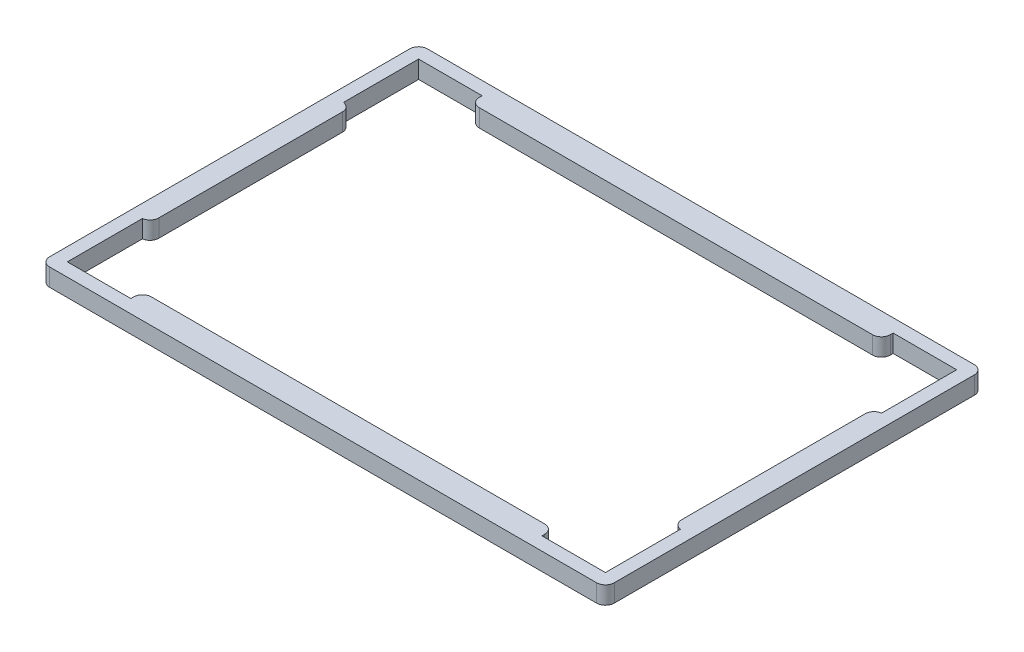
ISO-10303-21;
HEADER;
FILE_DESCRIPTION(('STEP AP214'),'2;1');
FILE_NAME('part.step','',(''),(''),'','','');
FILE_SCHEMA(('AUTOMOTIVE_DESIGN { 1 0 10303 214 1 1 1 1 }'));
ENDSEC;
DATA;
#1=APPLICATION_CONTEXT('core data for automotive mechanical design processes');
#2=APPLICATION_PROTOCOL_DEFINITION('international standard','automotive_design',2000,#1);
#3=PRODUCT_CONTEXT('',#1,'mechanical');
#4=PRODUCT('Part','Part','',(#3));
#5=PRODUCT_RELATED_PRODUCT_CATEGORY('part','',(#4));
#6=PRODUCT_DEFINITION_FORMATION('','',#4);
#7=PRODUCT_DEFINITION_CONTEXT('part definition',#1,'design');
#8=PRODUCT_DEFINITION('design','',#6,#7);
#9=PRODUCT_DEFINITION_SHAPE('','',#8);
#10=(LENGTH_UNIT() NAMED_UNIT(*) SI_UNIT(.MILLI.,.METRE.));
#11=(NAMED_UNIT(*) PLANE_ANGLE_UNIT() SI_UNIT($,.RADIAN.));
#12=(NAMED_UNIT(*) SI_UNIT($,.STERADIAN.) SOLID_ANGLE_UNIT());
#13=UNCERTAINTY_MEASURE_WITH_UNIT(LENGTH_MEASURE(1.E-05),#10,'distance_accuracy_value','');
#14=(GEOMETRIC_REPRESENTATION_CONTEXT(3) GLOBAL_UNCERTAINTY_ASSIGNED_CONTEXT((#13)) GLOBAL_UNIT_ASSIGNED_CONTEXT((#10,
#11,#12)) REPRESENTATION_CONTEXT('',''));
#15=CARTESIAN_POINT('',(0.,0.,0.));
#16=DIRECTION('',(0.,0.,1.));
#17=DIRECTION('',(1.,0.,0.));
#18=AXIS2_PLACEMENT_3D('',#15,#16,#17);
#19=CARTESIAN_POINT('',(0.,4.,39.74));
#20=DIRECTION('',(0.,0.,1.));
#21=DIRECTION('',(1.,0.,0.));
#22=AXIS2_PLACEMENT_3D('',#19,#20,#21);
#23=PLANE('',#22);
#24=DIRECTION('',(-1.,0.,0.));
#25=VECTOR('',#24,1.);
#26=CARTESIAN_POINT('',(0.,0.,39.74));
#27=LINE('',#26,#25);
#28=CARTESIAN_POINT('',(60.88,0.,39.74));
#29=VERTEX_POINT('',#28);
#30=CARTESIAN_POINT('',(46.5,0.,39.74));
#31=VERTEX_POINT('',#30);
#32=EDGE_CURVE('E268',#29,#31,#27,.T.);
#33=ORIENTED_EDGE('',*,*,#32,.T.);
#34=DIRECTION('',(0.,-1.,0.));
#35=VECTOR('',#34,1.);
#36=CARTESIAN_POINT('',(46.5,4.,39.74));
#37=LINE('',#36,#35);
#38=CARTESIAN_POINT('',(46.5,4.,39.74));
#39=VERTEX_POINT('',#38);
#40=EDGE_CURVE('E250',#39,#31,#37,.T.);
#41=ORIENTED_EDGE('',*,*,#40,.F.);
#42=DIRECTION('',(-1.,0.,0.));
#43=VECTOR('',#42,1.);
#44=CARTESIAN_POINT('',(0.,4.,39.74));
#45=LINE('',#44,#43);
#46=CARTESIAN_POINT('',(60.88,4.,39.74));
#47=VERTEX_POINT('',#46);
#48=EDGE_CURVE('E256',#47,#39,#45,.T.);
#49=ORIENTED_EDGE('',*,*,#48,.F.);
#50=DIRECTION('',(0.,-1.,0.));
#51=VECTOR('',#50,1.);
#52=CARTESIAN_POINT('',(60.88,4.,39.74));
#53=LINE('',#52,#51);
#54=EDGE_CURVE('E427',#47,#29,#53,.T.);
#55=ORIENTED_EDGE('',*,*,#54,.T.);
#56=EDGE_LOOP('',(#33,#41,#49,#55));
#57=FACE_BOUND('',#56,.T.);
#58=ADVANCED_FACE('F35',(#57),#23,.F.);
#59=CARTESIAN_POINT('',(46.5,4.,0.));
#60=DIRECTION('',(1.,0.,0.));
#61=DIRECTION('',(0.,0.,-1.));
#62=AXIS2_PLACEMENT_3D('',#59,#60,#61);
#63=PLANE('',#62);
#64=DIRECTION('',(0.,0.,1.));
#65=VECTOR('',#64,1.);
#66=CARTESIAN_POINT('',(46.5,0.,0.));
#67=LINE('',#66,#65);
#68=CARTESIAN_POINT('',(46.5,0.,39.09));
#69=VERTEX_POINT('',#68);
#70=EDGE_CURVE('E394',#69,#31,#67,.T.);
#71=ORIENTED_EDGE('',*,*,#70,.F.);
#72=DIRECTION('',(0.,-1.,0.));
#73=VECTOR('',#72,1.);
#74=CARTESIAN_POINT('',(46.5,4.,39.09));
#75=LINE('',#74,#73);
#76=CARTESIAN_POINT('',(46.5,4.,39.09));
#77=VERTEX_POINT('',#76);
#78=EDGE_CURVE('E253',#69,#77,#75,.F.);
#79=ORIENTED_EDGE('',*,*,#78,.T.);
#80=DIRECTION('',(0.,0.,1.));
#81=VECTOR('',#80,1.);
#82=CARTESIAN_POINT('',(46.5,4.,0.));
#83=LINE('',#82,#81);
#84=EDGE_CURVE('E245',#77,#39,#83,.T.);
#85=ORIENTED_EDGE('',*,*,#84,.T.);
#86=ORIENTED_EDGE('',*,*,#40,.T.);
#87=EDGE_LOOP('',(#71,#79,#85,#86));
#88=FACE_BOUND('',#87,.T.);
#89=ADVANCED_FACE('F248',(#88),#63,.T.);
#90=CARTESIAN_POINT('',(0.,4.,37.09));
#91=DIRECTION('',(0.,0.,1.));
#92=DIRECTION('',(1.,0.,0.));
#93=AXIS2_PLACEMENT_3D('',#90,#91,#92);
#94=PLANE('',#93);
#95=DIRECTION('',(-1.,0.,0.));
#96=VECTOR('',#95,1.);
#97=CARTESIAN_POINT('',(0.,4.,37.09));
#98=LINE('',#97,#96);
#99=CARTESIAN_POINT('',(44.5,4.,37.09));
#100=VERTEX_POINT('',#99);
#101=CARTESIAN_POINT('',(-44.5,4.,37.09));
#102=VERTEX_POINT('',#101);
#103=EDGE_CURVE('E255',#100,#102,#98,.T.);
#104=ORIENTED_EDGE('',*,*,#103,.F.);
#105=DIRECTION('',(0.,-1.,0.));
#106=VECTOR('',#105,1.);
#107=CARTESIAN_POINT('',(44.5,0.,37.09));
#108=LINE('',#107,#106);
#109=CARTESIAN_POINT('',(44.5,0.,37.09));
#110=VERTEX_POINT('',#109);
#111=EDGE_CURVE('E272',#100,#110,#108,.T.);
#112=ORIENTED_EDGE('',*,*,#111,.T.);
#113=DIRECTION('',(-1.,0.,0.));
#114=VECTOR('',#113,1.);
#115=CARTESIAN_POINT('',(0.,0.,37.09));
#116=LINE('',#115,#114);
#117=CARTESIAN_POINT('',(-44.5,0.,37.09));
#118=VERTEX_POINT('',#117);
#119=EDGE_CURVE('E397',#110,#118,#116,.T.);
#120=ORIENTED_EDGE('',*,*,#119,.T.);
#121=DIRECTION('',(0.,-1.,0.));
#122=VECTOR('',#121,1.);
#123=CARTESIAN_POINT('',(-44.5,4.,37.09));
#124=LINE('',#123,#122);
#125=EDGE_CURVE('E269',#118,#102,#124,.F.);
#126=ORIENTED_EDGE('',*,*,#125,.T.);
#127=EDGE_LOOP('',(#104,#112,#120,#126));
#128=FACE_BOUND('',#127,.T.);
#129=ADVANCED_FACE('F533',(#128),#94,.F.);
#130=CARTESIAN_POINT('',(-46.5,4.,0.));
#131=DIRECTION('',(1.,0.,0.));
#132=DIRECTION('',(0.,0.,-1.));
#133=AXIS2_PLACEMENT_3D('',#130,#131,#132);
#134=PLANE('',#133);
#135=DIRECTION('',(0.,0.,1.));
#136=VECTOR('',#135,1.);
#137=CARTESIAN_POINT('',(-46.5,4.,0.));
#138=LINE('',#137,#136);
#139=CARTESIAN_POINT('',(-46.5,4.,39.09));
#140=VERTEX_POINT('',#139);
#141=CARTESIAN_POINT('',(-46.5,4.,39.74));
#142=VERTEX_POINT('',#141);
#143=EDGE_CURVE('E522',#140,#142,#138,.T.);
#144=ORIENTED_EDGE('',*,*,#143,.F.);
#145=DIRECTION('',(0.,-1.,0.));
#146=VECTOR('',#145,1.);
#147=CARTESIAN_POINT('',(-46.5,4.,39.09));
#148=LINE('',#147,#146);
#149=CARTESIAN_POINT('',(-46.5,0.,39.09));
#150=VERTEX_POINT('',#149);
#151=EDGE_CURVE('E348',#140,#150,#148,.T.);
#152=ORIENTED_EDGE('',*,*,#151,.T.);
#153=DIRECTION('',(0.,0.,1.));
#154=VECTOR('',#153,1.);
#155=CARTESIAN_POINT('',(-46.5,0.,0.));
#156=LINE('',#155,#154);
#157=CARTESIAN_POINT('',(-46.5,0.,39.74));
#158=VERTEX_POINT('',#157);
#159=EDGE_CURVE('E400',#150,#158,#156,.T.);
#160=ORIENTED_EDGE('',*,*,#159,.T.);
#161=DIRECTION('',(0.,-1.,0.));
#162=VECTOR('',#161,1.);
#163=CARTESIAN_POINT('',(-46.5,4.,39.74));
#164=LINE('',#163,#162);
#165=EDGE_CURVE('E270',#142,#158,#164,.T.);
#166=ORIENTED_EDGE('',*,*,#165,.F.);
#167=EDGE_LOOP('',(#144,#152,#160,#166));
#168=FACE_BOUND('',#167,.T.);
#169=ADVANCED_FACE('F527',(#168),#134,.F.);
#170=CARTESIAN_POINT('',(-60.88,0.,39.74));
#171=VERTEX_POINT('',#170);
#172=EDGE_CURVE('E395',#158,#171,#27,.T.);
#173=ORIENTED_EDGE('',*,*,#172,.T.);
#174=DIRECTION('',(0.,-1.,0.));
#175=VECTOR('',#174,1.);
#176=CARTESIAN_POINT('',(-60.88,4.,39.74));
#177=LINE('',#176,#175);
#178=CARTESIAN_POINT('',(-60.88,4.,39.74));
#179=VERTEX_POINT('',#178);
#180=EDGE_CURVE('E275',#179,#171,#177,.T.);
#181=ORIENTED_EDGE('',*,*,#180,.F.);
#182=EDGE_CURVE('E266',#142,#179,#45,.T.);
#183=ORIENTED_EDGE('',*,*,#182,.F.);
#184=ORIENTED_EDGE('',*,*,#165,.T.);
#185=EDGE_LOOP('',(#173,#181,#183,#184));
#186=FACE_BOUND('',#185,.T.);
#187=ADVANCED_FACE('F525',(#186),#23,.F.);
#188=CARTESIAN_POINT('',(-60.88,4.,0.));
#189=DIRECTION('',(-1.,0.,0.));
#190=DIRECTION('',(0.,0.,1.));
#191=AXIS2_PLACEMENT_3D('',#188,#189,#190);
#192=PLANE('',#191);
#193=DIRECTION('',(0.,0.,-1.));
#194=VECTOR('',#193,1.);
#195=CARTESIAN_POINT('',(-60.88,0.,0.));
#196=LINE('',#195,#194);
#197=CARTESIAN_POINT('',(-60.88,0.,22.75));
#198=VERTEX_POINT('',#197);
#199=EDGE_CURVE('E402',#171,#198,#196,.T.);
#200=ORIENTED_EDGE('',*,*,#199,.T.);
#201=DIRECTION('',(0.,-1.,0.));
#202=VECTOR('',#201,1.);
#203=CARTESIAN_POINT('',(-60.88,4.,22.75));
#204=LINE('',#203,#202);
#205=CARTESIAN_POINT('',(-60.88,4.,22.75));
#206=VERTEX_POINT('',#205);
#207=EDGE_CURVE('E448',#206,#198,#204,.T.);
#208=ORIENTED_EDGE('',*,*,#207,.F.);
#209=DIRECTION('',(0.,0.,-1.));
#210=VECTOR('',#209,1.);
#211=CARTESIAN_POINT('',(-60.88,4.,0.));
#212=LINE('',#211,#210);
#213=EDGE_CURVE('E457',#179,#206,#212,.T.);
#214=ORIENTED_EDGE('',*,*,#213,.F.);
#215=ORIENTED_EDGE('',*,*,#180,.T.);
#216=EDGE_LOOP('',(#200,#208,#214,#215));
#217=FACE_BOUND('',#216,.T.);
#218=ADVANCED_FACE('F455',(#217),#192,.F.);
#219=CARTESIAN_POINT('',(-59.15,4.,0.));
#220=DIRECTION('',(-1.,0.,0.));
#221=DIRECTION('',(0.,0.,1.));
#222=AXIS2_PLACEMENT_3D('',#219,#220,#221);
#223=PLANE('',#222);
#224=DIRECTION('',(0.,0.,-1.));
#225=VECTOR('',#224,1.);
#226=CARTESIAN_POINT('',(-59.15,0.,0.));
#227=LINE('',#226,#225);
#228=CARTESIAN_POINT('',(-59.15,0.,20.7683088030674));
#229=VERTEX_POINT('',#228);
#230=CARTESIAN_POINT('',(-59.15,0.,-20.7683088030674));
#231=VERTEX_POINT('',#230);
#232=EDGE_CURVE('E405',#229,#231,#227,.T.);
#233=ORIENTED_EDGE('',*,*,#232,.T.);
#234=DIRECTION('',(0.,-1.,0.));
#235=VECTOR('',#234,1.);
#236=CARTESIAN_POINT('',(-59.15,4.,-20.7683088030674));
#237=LINE('',#236,#235);
#238=CARTESIAN_POINT('',(-59.15,4.,-20.7683088030674));
#239=VERTEX_POINT('',#238);
#240=EDGE_CURVE('E346',#231,#239,#237,.F.);
#241=ORIENTED_EDGE('',*,*,#240,.T.);
#242=DIRECTION('',(0.,0.,-1.));
#243=VECTOR('',#242,1.);
#244=CARTESIAN_POINT('',(-59.15,4.,0.));
#245=LINE('',#244,#243);
#246=CARTESIAN_POINT('',(-59.15,4.,20.7683088030674));
#247=VERTEX_POINT('',#246);
#248=EDGE_CURVE('E473',#247,#239,#245,.T.);
#249=ORIENTED_EDGE('',*,*,#248,.F.);
#250=DIRECTION('',(0.,-1.,0.));
#251=VECTOR('',#250,1.);
#252=CARTESIAN_POINT('',(-59.15,4.,20.7683088030674));
#253=LINE('',#252,#251);
#254=EDGE_CURVE('E343',#247,#229,#253,.T.);
#255=ORIENTED_EDGE('',*,*,#254,.T.);
#256=EDGE_LOOP('',(#233,#241,#249,#255));
#257=FACE_BOUND('',#256,.T.);
#258=ADVANCED_FACE('F470',(#257),#223,.F.);
#259=CARTESIAN_POINT('',(-60.88,0.,-22.75));
#260=VERTEX_POINT('',#259);
#261=CARTESIAN_POINT('',(-60.88,0.,-39.74));
#262=VERTEX_POINT('',#261);
#263=EDGE_CURVE('E406',#260,#262,#196,.T.);
#264=ORIENTED_EDGE('',*,*,#263,.T.);
#265=DIRECTION('',(0.,-1.,0.));
#266=VECTOR('',#265,1.);
#267=CARTESIAN_POINT('',(-60.88,4.,-39.74));
#268=LINE('',#267,#266);
#269=CARTESIAN_POINT('',(-60.88,4.,-39.74));
#270=VERTEX_POINT('',#269);
#271=EDGE_CURVE('E443',#270,#262,#268,.T.);
#272=ORIENTED_EDGE('',*,*,#271,.F.);
#273=CARTESIAN_POINT('',(-60.88,4.,-22.75));
#274=VERTEX_POINT('',#273);
#275=EDGE_CURVE('E475',#274,#270,#212,.T.);
#276=ORIENTED_EDGE('',*,*,#275,.F.);
#277=DIRECTION('',(0.,-1.,0.));
#278=VECTOR('',#277,1.);
#279=CARTESIAN_POINT('',(-60.88,4.,-22.75));
#280=LINE('',#279,#278);
#281=EDGE_CURVE('E445',#274,#260,#280,.T.);
#282=ORIENTED_EDGE('',*,*,#281,.T.);
#283=EDGE_LOOP('',(#264,#272,#276,#282));
#284=FACE_BOUND('',#283,.T.);
#285=ADVANCED_FACE('F592',(#284),#192,.F.);
#286=CARTESIAN_POINT('',(0.,4.,-39.74));
#287=DIRECTION('',(0.,0.,1.));
#288=DIRECTION('',(1.,0.,0.));
#289=AXIS2_PLACEMENT_3D('',#286,#287,#288);
#290=PLANE('',#289);
#291=DIRECTION('',(-1.,0.,0.));
#292=VECTOR('',#291,1.);
#293=CARTESIAN_POINT('',(0.,0.,-39.74));
#294=LINE('',#293,#292);
#295=CARTESIAN_POINT('',(-46.5,0.,-39.74));
#296=VERTEX_POINT('',#295);
#297=EDGE_CURVE('E409',#296,#262,#294,.T.);
#298=ORIENTED_EDGE('',*,*,#297,.F.);
#299=DIRECTION('',(0.,-1.,0.));
#300=VECTOR('',#299,1.);
#301=CARTESIAN_POINT('',(-46.5,4.,-39.74));
#302=LINE('',#301,#300);
#303=CARTESIAN_POINT('',(-46.5,4.,-39.74));
#304=VERTEX_POINT('',#303);
#305=EDGE_CURVE('E440',#304,#296,#302,.T.);
#306=ORIENTED_EDGE('',*,*,#305,.F.);
#307=DIRECTION('',(-1.,0.,0.));
#308=VECTOR('',#307,1.);
#309=CARTESIAN_POINT('',(0.,4.,-39.74));
#310=LINE('',#309,#308);
#311=EDGE_CURVE('E477',#304,#270,#310,.T.);
#312=ORIENTED_EDGE('',*,*,#311,.T.);
#313=ORIENTED_EDGE('',*,*,#271,.T.);
#314=EDGE_LOOP('',(#298,#306,#312,#313));
#315=FACE_BOUND('',#314,.T.);
#316=ADVANCED_FACE('F587',(#315),#290,.T.);
#317=CARTESIAN_POINT('',(-46.5,4.,0.));
#318=DIRECTION('',(-1.,0.,0.));
#319=DIRECTION('',(0.,0.,1.));
#320=AXIS2_PLACEMENT_3D('',#317,#318,#319);
#321=PLANE('',#320);
#322=DIRECTION('',(0.,0.,-1.));
#323=VECTOR('',#322,1.);
#324=CARTESIAN_POINT('',(-46.5,0.,0.));
#325=LINE('',#324,#323);
#326=CARTESIAN_POINT('',(-46.5,0.,-39.09));
#327=VERTEX_POINT('',#326);
#328=EDGE_CURVE('E412',#327,#296,#325,.T.);
#329=ORIENTED_EDGE('',*,*,#328,.F.);
#330=DIRECTION('',(0.,-1.,0.));
#331=VECTOR('',#330,1.);
#332=CARTESIAN_POINT('',(-46.5,4.,-39.09));
#333=LINE('',#332,#331);
#334=CARTESIAN_POINT('',(-46.5,4.,-39.09));
#335=VERTEX_POINT('',#334);
#336=EDGE_CURVE('E341',#327,#335,#333,.F.);
#337=ORIENTED_EDGE('',*,*,#336,.T.);
#338=DIRECTION('',(0.,0.,-1.));
#339=VECTOR('',#338,1.);
#340=CARTESIAN_POINT('',(-46.5,4.,0.));
#341=LINE('',#340,#339);
#342=EDGE_CURVE('E483',#335,#304,#341,.T.);
#343=ORIENTED_EDGE('',*,*,#342,.T.);
#344=ORIENTED_EDGE('',*,*,#305,.T.);
#345=EDGE_LOOP('',(#329,#337,#343,#344));
#346=FACE_BOUND('',#345,.T.);
#347=ADVANCED_FACE('F583',(#346),#321,.T.);
#348=CARTESIAN_POINT('',(0.,4.,-37.09));
#349=DIRECTION('',(0.,0.,1.));
#350=DIRECTION('',(1.,0.,0.));
#351=AXIS2_PLACEMENT_3D('',#348,#349,#350);
#352=PLANE('',#351);
#353=DIRECTION('',(-1.,0.,0.));
#354=VECTOR('',#353,1.);
#355=CARTESIAN_POINT('',(0.,0.,-37.09));
#356=LINE('',#355,#354);
#357=CARTESIAN_POINT('',(44.5,0.,-37.09));
#358=VERTEX_POINT('',#357);
#359=CARTESIAN_POINT('',(-44.5,0.,-37.09));
#360=VERTEX_POINT('',#359);
#361=EDGE_CURVE('E415',#358,#360,#356,.T.);
#362=ORIENTED_EDGE('',*,*,#361,.F.);
#363=DIRECTION('',(0.,-1.,0.));
#364=VECTOR('',#363,1.);
#365=CARTESIAN_POINT('',(44.5,4.,-37.09));
#366=LINE('',#365,#364);
#367=CARTESIAN_POINT('',(44.5,4.,-37.09));
#368=VERTEX_POINT('',#367);
#369=EDGE_CURVE('E339',#358,#368,#366,.F.);
#370=ORIENTED_EDGE('',*,*,#369,.T.);
#371=DIRECTION('',(-1.,0.,0.));
#372=VECTOR('',#371,1.);
#373=CARTESIAN_POINT('',(0.,4.,-37.09));
#374=LINE('',#373,#372);
#375=CARTESIAN_POINT('',(-44.5,4.,-37.09));
#376=VERTEX_POINT('',#375);
#377=EDGE_CURVE('E486',#368,#376,#374,.T.);
#378=ORIENTED_EDGE('',*,*,#377,.T.);
#379=DIRECTION('',(0.,-1.,0.));
#380=VECTOR('',#379,1.);
#381=CARTESIAN_POINT('',(-44.5,4.,-37.09));
#382=LINE('',#381,#380);
#383=EDGE_CURVE('E336',#376,#360,#382,.T.);
#384=ORIENTED_EDGE('',*,*,#383,.T.);
#385=EDGE_LOOP('',(#362,#370,#378,#384));
#386=FACE_BOUND('',#385,.T.);
#387=ADVANCED_FACE('F573',(#386),#352,.T.);
#388=CARTESIAN_POINT('',(46.5,4.,0.));
#389=DIRECTION('',(-1.,0.,0.));
#390=DIRECTION('',(0.,0.,1.));
#391=AXIS2_PLACEMENT_3D('',#388,#389,#390);
#392=PLANE('',#391);
#393=DIRECTION('',(0.,0.,-1.));
#394=VECTOR('',#393,1.);
#395=CARTESIAN_POINT('',(46.5,4.,0.));
#396=LINE('',#395,#394);
#397=CARTESIAN_POINT('',(46.5,4.,-39.09));
#398=VERTEX_POINT('',#397);
#399=CARTESIAN_POINT('',(46.5,4.,-39.74));
#400=VERTEX_POINT('',#399);
#401=EDGE_CURVE('E489',#398,#400,#396,.T.);
#402=ORIENTED_EDGE('',*,*,#401,.F.);
#403=DIRECTION('',(0.,-1.,0.));
#404=VECTOR('',#403,1.);
#405=CARTESIAN_POINT('',(46.5,0.,-39.09));
#406=LINE('',#405,#404);
#407=CARTESIAN_POINT('',(46.5,0.,-39.09));
#408=VERTEX_POINT('',#407);
#409=EDGE_CURVE('E333',#398,#408,#406,.T.);
#410=ORIENTED_EDGE('',*,*,#409,.T.);
#411=DIRECTION('',(0.,0.,-1.));
#412=VECTOR('',#411,1.);
#413=CARTESIAN_POINT('',(46.5,0.,0.));
#414=LINE('',#413,#412);
#415=CARTESIAN_POINT('',(46.5,0.,-39.74));
#416=VERTEX_POINT('',#415);
#417=EDGE_CURVE('E418',#408,#416,#414,.T.);
#418=ORIENTED_EDGE('',*,*,#417,.T.);
#419=DIRECTION('',(0.,-1.,0.));
#420=VECTOR('',#419,1.);
#421=CARTESIAN_POINT('',(46.5,4.,-39.74));
#422=LINE('',#421,#420);
#423=EDGE_CURVE('E437',#400,#416,#422,.T.);
#424=ORIENTED_EDGE('',*,*,#423,.F.);
#425=EDGE_LOOP('',(#402,#410,#418,#424));
#426=FACE_BOUND('',#425,.T.);
#427=ADVANCED_FACE('F565',(#426),#392,.F.);
#428=CARTESIAN_POINT('',(60.88,0.,-39.74));
#429=VERTEX_POINT('',#428);
#430=EDGE_CURVE('E413',#429,#416,#294,.T.);
#431=ORIENTED_EDGE('',*,*,#430,.F.);
#432=DIRECTION('',(0.,-1.,0.));
#433=VECTOR('',#432,1.);
#434=CARTESIAN_POINT('',(60.88,4.,-39.74));
#435=LINE('',#434,#433);
#436=CARTESIAN_POINT('',(60.88,4.,-39.74));
#437=VERTEX_POINT('',#436);
#438=EDGE_CURVE('E435',#437,#429,#435,.T.);
#439=ORIENTED_EDGE('',*,*,#438,.F.);
#440=EDGE_CURVE('E484',#437,#400,#310,.T.);
#441=ORIENTED_EDGE('',*,*,#440,.T.);
#442=ORIENTED_EDGE('',*,*,#423,.T.);
#443=EDGE_LOOP('',(#431,#439,#441,#442));
#444=FACE_BOUND('',#443,.T.);
#445=ADVANCED_FACE('F559',(#444),#290,.T.);
#446=CARTESIAN_POINT('',(60.88,4.,0.));
#447=DIRECTION('',(-1.,0.,0.));
#448=DIRECTION('',(0.,0.,1.));
#449=AXIS2_PLACEMENT_3D('',#446,#447,#448);
#450=PLANE('',#449);
#451=DIRECTION('',(0.,0.,-1.));
#452=VECTOR('',#451,1.);
#453=CARTESIAN_POINT('',(60.88,0.,0.));
#454=LINE('',#453,#452);
#455=CARTESIAN_POINT('',(60.88,0.,-22.75));
#456=VERTEX_POINT('',#455);
#457=EDGE_CURVE('E420',#456,#429,#454,.T.);
#458=ORIENTED_EDGE('',*,*,#457,.F.);
#459=DIRECTION('',(0.,-1.,0.));
#460=VECTOR('',#459,1.);
#461=CARTESIAN_POINT('',(60.88,4.,-22.75));
#462=LINE('',#461,#460);
#463=CARTESIAN_POINT('',(60.88,4.,-22.75));
#464=VERTEX_POINT('',#463);
#465=EDGE_CURVE('E432',#464,#456,#462,.T.);
#466=ORIENTED_EDGE('',*,*,#465,.F.);
#467=DIRECTION('',(0.,0.,-1.));
#468=VECTOR('',#467,1.);
#469=CARTESIAN_POINT('',(60.88,4.,0.));
#470=LINE('',#469,#468);
#471=EDGE_CURVE('E491',#464,#437,#470,.T.);
#472=ORIENTED_EDGE('',*,*,#471,.T.);
#473=ORIENTED_EDGE('',*,*,#438,.T.);
#474=EDGE_LOOP('',(#458,#466,#472,#473));
#475=FACE_BOUND('',#474,.T.);
#476=ADVANCED_FACE('F554',(#475),#450,.T.);
#477=CARTESIAN_POINT('',(59.15,4.,0.));
#478=DIRECTION('',(-1.,0.,0.));
#479=DIRECTION('',(0.,0.,1.));
#480=AXIS2_PLACEMENT_3D('',#477,#478,#479);
#481=PLANE('',#480);
#482=DIRECTION('',(0.,0.,-1.));
#483=VECTOR('',#482,1.);
#484=CARTESIAN_POINT('',(59.15,0.,0.));
#485=LINE('',#484,#483);
#486=CARTESIAN_POINT('',(59.15,0.,20.7683088030674));
#487=VERTEX_POINT('',#486);
#488=CARTESIAN_POINT('',(59.15,0.,-20.7683088030675));
#489=VERTEX_POINT('',#488);
#490=EDGE_CURVE('E423',#487,#489,#485,.T.);
#491=ORIENTED_EDGE('',*,*,#490,.F.);
#492=DIRECTION('',(0.,-1.,0.));
#493=VECTOR('',#492,1.);
#494=CARTESIAN_POINT('',(59.15,4.,20.7683088030674));
#495=LINE('',#494,#493);
#496=CARTESIAN_POINT('',(59.15,4.,20.7683088030674));
#497=VERTEX_POINT('',#496);
#498=EDGE_CURVE('E57',#487,#497,#495,.F.);
#499=ORIENTED_EDGE('',*,*,#498,.T.);
#500=DIRECTION('',(0.,0.,-1.));
#501=VECTOR('',#500,1.);
#502=CARTESIAN_POINT('',(59.15,4.,0.));
#503=LINE('',#502,#501);
#504=CARTESIAN_POINT('',(59.15,4.,-20.7683088030675));
#505=VERTEX_POINT('',#504);
#506=EDGE_CURVE('E494',#497,#505,#503,.T.);
#507=ORIENTED_EDGE('',*,*,#506,.T.);
#508=DIRECTION('',(0.,-1.,0.));
#509=VECTOR('',#508,1.);
#510=CARTESIAN_POINT('',(59.15,0.,-20.7683088030675));
#511=LINE('',#510,#509);
#512=EDGE_CURVE('E329',#505,#489,#511,.T.);
#513=ORIENTED_EDGE('',*,*,#512,.T.);
#514=EDGE_LOOP('',(#491,#499,#507,#513));
#515=FACE_BOUND('',#514,.T.);
#516=ADVANCED_FACE('F547',(#515),#481,.T.);
#517=CARTESIAN_POINT('',(-63.88,4.,0.));
#518=DIRECTION('',(-1.,0.,0.));
#519=DIRECTION('',(0.,0.,1.));
#520=AXIS2_PLACEMENT_3D('',#517,#518,#519);
#521=PLANE('',#520);
#522=DIRECTION('',(0.,0.,-1.));
#523=VECTOR('',#522,1.);
#524=CARTESIAN_POINT('',(-63.88,0.,0.));
#525=LINE('',#524,#523);
#526=CARTESIAN_POINT('',(-63.88,0.,40.74));
#527=VERTEX_POINT('',#526);
#528=CARTESIAN_POINT('',(-63.88,0.,-40.74));
#529=VERTEX_POINT('',#528);
#530=EDGE_CURVE('E389',#527,#529,#525,.T.);
#531=ORIENTED_EDGE('',*,*,#530,.F.);
#532=DIRECTION('',(0.,-1.,0.));
#533=VECTOR('',#532,1.);
#534=CARTESIAN_POINT('',(-63.88,4.,40.74));
#535=LINE('',#534,#533);
#536=CARTESIAN_POINT('',(-63.88,4.,40.74));
#537=VERTEX_POINT('',#536);
#538=EDGE_CURVE('E359',#527,#537,#535,.F.);
#539=ORIENTED_EDGE('',*,*,#538,.T.);
#540=DIRECTION('',(0.,0.,-1.));
#541=VECTOR('',#540,1.);
#542=CARTESIAN_POINT('',(-63.88,4.,0.));
#543=LINE('',#542,#541);
#544=CARTESIAN_POINT('',(-63.88,4.,-40.74));
#545=VERTEX_POINT('',#544);
#546=EDGE_CURVE('E511',#537,#545,#543,.T.);
#547=ORIENTED_EDGE('',*,*,#546,.T.);
#548=DIRECTION('',(0.,-1.,0.));
#549=VECTOR('',#548,1.);
#550=CARTESIAN_POINT('',(-63.88,0.,-40.74));
#551=LINE('',#550,#549);
#552=EDGE_CURVE('E356',#545,#529,#551,.T.);
#553=ORIENTED_EDGE('',*,*,#552,.T.);
#554=EDGE_LOOP('',(#531,#539,#547,#553));
#555=FACE_BOUND('',#554,.T.);
#556=ADVANCED_FACE('F499',(#555),#521,.T.);
#557=CARTESIAN_POINT('',(0.,4.,42.74));
#558=DIRECTION('',(0.,0.,1.));
#559=DIRECTION('',(1.,0.,0.));
#560=AXIS2_PLACEMENT_3D('',#557,#558,#559);
#561=PLANE('',#560);
#562=DIRECTION('',(-1.,0.,0.));
#563=VECTOR('',#562,1.);
#564=CARTESIAN_POINT('',(0.,4.,42.74));
#565=LINE('',#564,#563);
#566=CARTESIAN_POINT('',(61.88,4.,42.74));
#567=VERTEX_POINT('',#566);
#568=CARTESIAN_POINT('',(-61.88,4.,42.74));
#569=VERTEX_POINT('',#568);
#570=EDGE_CURVE('E510',#567,#569,#565,.T.);
#571=ORIENTED_EDGE('',*,*,#570,.T.);
#572=DIRECTION('',(0.,-1.,0.));
#573=VECTOR('',#572,1.);
#574=CARTESIAN_POINT('',(-61.88,4.,42.74));
#575=LINE('',#574,#573);
#576=CARTESIAN_POINT('',(-61.88,0.,42.74));
#577=VERTEX_POINT('',#576);
#578=EDGE_CURVE('E353',#569,#577,#575,.T.);
#579=ORIENTED_EDGE('',*,*,#578,.T.);
#580=DIRECTION('',(-1.,0.,0.));
#581=VECTOR('',#580,1.);
#582=CARTESIAN_POINT('',(0.,0.,42.74));
#583=LINE('',#582,#581);
#584=CARTESIAN_POINT('',(61.88,0.,42.74));
#585=VERTEX_POINT('',#584);
#586=EDGE_CURVE('E385',#585,#577,#583,.T.);
#587=ORIENTED_EDGE('',*,*,#586,.F.);
#588=DIRECTION('',(0.,-1.,0.));
#589=VECTOR('',#588,1.);
#590=CARTESIAN_POINT('',(61.88,4.,42.74));
#591=LINE('',#590,#589);
#592=EDGE_CURVE('E351',#585,#567,#591,.F.);
#593=ORIENTED_EDGE('',*,*,#592,.T.);
#594=EDGE_LOOP('',(#571,#579,#587,#593));
#595=FACE_BOUND('',#594,.T.);
#596=ADVANCED_FACE('F513',(#595),#561,.T.);
#597=CARTESIAN_POINT('',(63.88,4.,0.));
#598=DIRECTION('',(-1.,0.,0.));
#599=DIRECTION('',(0.,0.,1.));
#600=AXIS2_PLACEMENT_3D('',#597,#598,#599);
#601=PLANE('',#600);
#602=DIRECTION('',(0.,0.,-1.));
#603=VECTOR('',#602,1.);
#604=CARTESIAN_POINT('',(63.88,0.,0.));
#605=LINE('',#604,#603);
#606=CARTESIAN_POINT('',(63.88,0.,40.74));
#607=VERTEX_POINT('',#606);
#608=CARTESIAN_POINT('',(63.88,0.,-40.74));
#609=VERTEX_POINT('',#608);
#610=EDGE_CURVE('E372',#607,#609,#605,.T.);
#611=ORIENTED_EDGE('',*,*,#610,.T.);
#612=DIRECTION('',(0.,-1.,0.));
#613=VECTOR('',#612,1.);
#614=CARTESIAN_POINT('',(63.88,4.,-40.74));
#615=LINE('',#614,#613);
#616=CARTESIAN_POINT('',(63.88,4.,-40.74));
#617=VERTEX_POINT('',#616);
#618=EDGE_CURVE('E11',#609,#617,#615,.F.);
#619=ORIENTED_EDGE('',*,*,#618,.T.);
#620=DIRECTION('',(0.,0.,-1.));
#621=VECTOR('',#620,1.);
#622=CARTESIAN_POINT('',(63.88,4.,0.));
#623=LINE('',#622,#621);
#624=CARTESIAN_POINT('',(63.88,4.,40.74));
#625=VERTEX_POINT('',#624);
#626=EDGE_CURVE('E375',#625,#617,#623,.T.);
#627=ORIENTED_EDGE('',*,*,#626,.F.);
#628=DIRECTION('',(0.,-1.,0.));
#629=VECTOR('',#628,1.);
#630=CARTESIAN_POINT('',(63.88,0.,40.74));
#631=LINE('',#630,#629);
#632=EDGE_CURVE('E43',#625,#607,#631,.T.);
#633=ORIENTED_EDGE('',*,*,#632,.T.);
#634=EDGE_LOOP('',(#611,#619,#627,#633));
#635=FACE_BOUND('',#634,.T.);
#636=ADVANCED_FACE('F371',(#635),#601,.F.);
#637=CARTESIAN_POINT('',(0.,4.,-42.74));
#638=DIRECTION('',(0.,0.,1.));
#639=DIRECTION('',(1.,0.,0.));
#640=AXIS2_PLACEMENT_3D('',#637,#638,#639);
#641=PLANE('',#640);
#642=DIRECTION('',(-1.,0.,0.));
#643=VECTOR('',#642,1.);
#644=CARTESIAN_POINT('',(0.,0.,-42.74));
#645=LINE('',#644,#643);
#646=CARTESIAN_POINT('',(61.88,0.,-42.74));
#647=VERTEX_POINT('',#646);
#648=CARTESIAN_POINT('',(-61.88,0.,-42.74));
#649=VERTEX_POINT('',#648);
#650=EDGE_CURVE('E384',#647,#649,#645,.T.);
#651=ORIENTED_EDGE('',*,*,#650,.T.);
#652=DIRECTION('',(0.,-1.,0.));
#653=VECTOR('',#652,1.);
#654=CARTESIAN_POINT('',(-61.88,4.,-42.74));
#655=LINE('',#654,#653);
#656=CARTESIAN_POINT('',(-61.88,4.,-42.74));
#657=VERTEX_POINT('',#656);
#658=EDGE_CURVE('E364',#649,#657,#655,.F.);
#659=ORIENTED_EDGE('',*,*,#658,.T.);
#660=DIRECTION('',(-1.,0.,0.));
#661=VECTOR('',#660,1.);
#662=CARTESIAN_POINT('',(0.,4.,-42.74));
#663=LINE('',#662,#661);
#664=CARTESIAN_POINT('',(61.88,4.,-42.74));
#665=VERTEX_POINT('',#664);
#666=EDGE_CURVE('E264',#665,#657,#663,.T.);
#667=ORIENTED_EDGE('',*,*,#666,.F.);
#668=DIRECTION('',(0.,-1.,0.));
#669=VECTOR('',#668,1.);
#670=CARTESIAN_POINT('',(61.88,4.,-42.74));
#671=LINE('',#670,#669);
#672=EDGE_CURVE('E361',#665,#647,#671,.T.);
#673=ORIENTED_EDGE('',*,*,#672,.T.);
#674=EDGE_LOOP('',(#651,#659,#667,#673));
#675=FACE_BOUND('',#674,.T.);
#676=ADVANCED_FACE('F624',(#675),#641,.F.);
#677=CARTESIAN_POINT('',(60.88,0.,22.75));
#678=VERTEX_POINT('',#677);
#679=EDGE_CURVE('E424',#29,#678,#454,.T.);
#680=ORIENTED_EDGE('',*,*,#679,.F.);
#681=ORIENTED_EDGE('',*,*,#54,.F.);
#682=CARTESIAN_POINT('',(60.88,4.,22.75));
#683=VERTEX_POINT('',#682);
#684=EDGE_CURVE('E262',#47,#683,#470,.T.);
#685=ORIENTED_EDGE('',*,*,#684,.T.);
#686=DIRECTION('',(0.,-1.,0.));
#687=VECTOR('',#686,1.);
#688=CARTESIAN_POINT('',(60.88,4.,22.75));
#689=LINE('',#688,#687);
#690=EDGE_CURVE('E429',#683,#678,#689,.T.);
#691=ORIENTED_EDGE('',*,*,#690,.T.);
#692=EDGE_LOOP('',(#680,#681,#685,#691));
#693=FACE_BOUND('',#692,.T.);
#694=ADVANCED_FACE('F542',(#693),#450,.T.);
#695=CARTESIAN_POINT('',(0.,4.,0.));
#696=DIRECTION('',(0.,1.,0.));
#697=DIRECTION('',(0.,0.,1.));
#698=AXIS2_PLACEMENT_3D('',#695,#696,#697);
#699=PLANE('',#698);
#700=ORIENTED_EDGE('',*,*,#546,.F.);
#701=CARTESIAN_POINT('',(-61.88,4.,40.74));
#702=DIRECTION('',(0.,1.,0.));
#703=DIRECTION('',(0.,0.,1.));
#704=AXIS2_PLACEMENT_3D('',#701,#702,#703);
#705=CIRCLE('',#704,2.);
#706=EDGE_CURVE('E312',#537,#569,#705,.T.);
#707=ORIENTED_EDGE('',*,*,#706,.T.);
#708=ORIENTED_EDGE('',*,*,#570,.F.);
#709=CARTESIAN_POINT('',(61.88,4.,40.74));
#710=DIRECTION('',(0.,1.,0.));
#711=DIRECTION('',(0.,0.,1.));
#712=AXIS2_PLACEMENT_3D('',#709,#710,#711);
#713=CIRCLE('',#712,2.);
#714=EDGE_CURVE('E306',#567,#625,#713,.T.);
#715=ORIENTED_EDGE('',*,*,#714,.T.);
#716=ORIENTED_EDGE('',*,*,#626,.T.);
#717=CARTESIAN_POINT('',(61.88,4.,-40.74));
#718=DIRECTION('',(0.,1.,0.));
#719=DIRECTION('',(0.,0.,1.));
#720=AXIS2_PLACEMENT_3D('',#717,#718,#719);
#721=CIRCLE('',#720,2.);
#722=EDGE_CURVE('E308',#617,#665,#721,.T.);
#723=ORIENTED_EDGE('',*,*,#722,.T.);
#724=ORIENTED_EDGE('',*,*,#666,.T.);
#725=CARTESIAN_POINT('',(-61.88,4.,-40.74));
#726=DIRECTION('',(0.,1.,0.));
#727=DIRECTION('',(0.,0.,1.));
#728=AXIS2_PLACEMENT_3D('',#725,#726,#727);
#729=CIRCLE('',#728,2.);
#730=EDGE_CURVE('E310',#657,#545,#729,.T.);
#731=ORIENTED_EDGE('',*,*,#730,.T.);
#732=EDGE_LOOP('',(#700,#707,#708,#715,#716,#723,#724,#731));
#733=FACE_BOUND('',#732,.T.);
#734=ORIENTED_EDGE('',*,*,#84,.F.);
#735=CARTESIAN_POINT('',(44.5,4.,39.09));
#736=DIRECTION('',(0.,1.,0.));
#737=DIRECTION('',(0.,0.,1.));
#738=AXIS2_PLACEMENT_3D('',#735,#736,#737);
#739=CIRCLE('',#738,2.);
#740=EDGE_CURVE('E327',#77,#100,#739,.T.);
#741=ORIENTED_EDGE('',*,*,#740,.T.);
#742=ORIENTED_EDGE('',*,*,#103,.T.);
#743=CARTESIAN_POINT('',(-44.5,4.,39.09));
#744=DIRECTION('',(0.,1.,0.));
#745=DIRECTION('',(0.,0.,1.));
#746=AXIS2_PLACEMENT_3D('',#743,#744,#745);
#747=CIRCLE('',#746,2.);
#748=EDGE_CURVE('E316',#102,#140,#747,.T.);
#749=ORIENTED_EDGE('',*,*,#748,.T.);
#750=ORIENTED_EDGE('',*,*,#143,.T.);
#751=ORIENTED_EDGE('',*,*,#182,.T.);
#752=ORIENTED_EDGE('',*,*,#213,.T.);
#753=CARTESIAN_POINT('',(-61.15,4.,20.7683088030674));
#754=DIRECTION('',(0.,1.,0.));
#755=DIRECTION('',(0.,0.,1.));
#756=AXIS2_PLACEMENT_3D('',#753,#754,#755);
#757=CIRCLE('',#756,2.);
#758=EDGE_CURVE('E314',#206,#247,#757,.T.);
#759=ORIENTED_EDGE('',*,*,#758,.T.);
#760=ORIENTED_EDGE('',*,*,#248,.T.);
#761=CARTESIAN_POINT('',(-61.15,4.,-20.7683088030674));
#762=DIRECTION('',(0.,1.,0.));
#763=DIRECTION('',(0.,0.,1.));
#764=AXIS2_PLACEMENT_3D('',#761,#762,#763);
#765=CIRCLE('',#764,2.);
#766=EDGE_CURVE('E318',#239,#274,#765,.T.);
#767=ORIENTED_EDGE('',*,*,#766,.T.);
#768=ORIENTED_EDGE('',*,*,#275,.T.);
#769=ORIENTED_EDGE('',*,*,#311,.F.);
#770=ORIENTED_EDGE('',*,*,#342,.F.);
#771=CARTESIAN_POINT('',(-44.5,4.,-39.09));
#772=DIRECTION('',(0.,1.,0.));
#773=DIRECTION('',(0.,0.,1.));
#774=AXIS2_PLACEMENT_3D('',#771,#772,#773);
#775=CIRCLE('',#774,2.);
#776=EDGE_CURVE('E320',#335,#376,#775,.T.);
#777=ORIENTED_EDGE('',*,*,#776,.T.);
#778=ORIENTED_EDGE('',*,*,#377,.F.);
#779=CARTESIAN_POINT('',(44.5,4.,-39.09));
#780=DIRECTION('',(0.,1.,0.));
#781=DIRECTION('',(0.,0.,1.));
#782=AXIS2_PLACEMENT_3D('',#779,#780,#781);
#783=CIRCLE('',#782,2.);
#784=EDGE_CURVE('E322',#368,#398,#783,.T.);
#785=ORIENTED_EDGE('',*,*,#784,.T.);
#786=ORIENTED_EDGE('',*,*,#401,.T.);
#787=ORIENTED_EDGE('',*,*,#440,.F.);
#788=ORIENTED_EDGE('',*,*,#471,.F.);
#789=CARTESIAN_POINT('',(61.15,4.,-20.7683088030675));
#790=DIRECTION('',(0.,1.,0.));
#791=DIRECTION('',(0.,0.,1.));
#792=AXIS2_PLACEMENT_3D('',#789,#790,#791);
#793=CIRCLE('',#792,2.);
#794=EDGE_CURVE('E50',#464,#505,#793,.T.);
#795=ORIENTED_EDGE('',*,*,#794,.T.);
#796=ORIENTED_EDGE('',*,*,#506,.F.);
#797=CARTESIAN_POINT('',(61.15,4.,20.7683088030674));
#798=DIRECTION('',(0.,1.,0.));
#799=DIRECTION('',(0.,0.,1.));
#800=AXIS2_PLACEMENT_3D('',#797,#798,#799);
#801=CIRCLE('',#800,2.);
#802=EDGE_CURVE('E325',#497,#683,#801,.T.);
#803=ORIENTED_EDGE('',*,*,#802,.T.);
#804=ORIENTED_EDGE('',*,*,#684,.F.);
#805=ORIENTED_EDGE('',*,*,#48,.T.);
#806=EDGE_LOOP('',(#734,#741,#742,#749,#750,#751,#752,#759,#760,#767,#768,#769,#770,#777,#778,
#785,#786,#787,#788,#795,#796,#803,#804,#805));
#807=FACE_BOUND('',#806,.T.);
#808=ADVANCED_FACE('F260',(#733,#807),#699,.T.);
#809=CARTESIAN_POINT('',(0.,0.,0.));
#810=DIRECTION('',(0.,1.,0.));
#811=DIRECTION('',(0.,0.,1.));
#812=AXIS2_PLACEMENT_3D('',#809,#810,#811);
#813=PLANE('',#812);
#814=ORIENTED_EDGE('',*,*,#586,.T.);
#815=CARTESIAN_POINT('',(-61.88,0.,40.74));
#816=DIRECTION('',(0.,1.,0.));
#817=DIRECTION('',(0.,0.,1.));
#818=AXIS2_PLACEMENT_3D('',#815,#816,#817);
#819=CIRCLE('',#818,2.);
#820=EDGE_CURVE('E287',#577,#527,#819,.F.);
#821=ORIENTED_EDGE('',*,*,#820,.T.);
#822=ORIENTED_EDGE('',*,*,#530,.T.);
#823=CARTESIAN_POINT('',(-61.88,0.,-40.74));
#824=DIRECTION('',(0.,1.,0.));
#825=DIRECTION('',(0.,0.,1.));
#826=AXIS2_PLACEMENT_3D('',#823,#824,#825);
#827=CIRCLE('',#826,2.);
#828=EDGE_CURVE('E285',#529,#649,#827,.F.);
#829=ORIENTED_EDGE('',*,*,#828,.T.);
#830=ORIENTED_EDGE('',*,*,#650,.F.);
#831=CARTESIAN_POINT('',(61.88,0.,-40.74));
#832=DIRECTION('',(0.,1.,0.));
#833=DIRECTION('',(0.,0.,1.));
#834=AXIS2_PLACEMENT_3D('',#831,#832,#833);
#835=CIRCLE('',#834,2.);
#836=EDGE_CURVE('E283',#647,#609,#835,.F.);
#837=ORIENTED_EDGE('',*,*,#836,.T.);
#838=ORIENTED_EDGE('',*,*,#610,.F.);
#839=CARTESIAN_POINT('',(61.88,0.,40.74));
#840=DIRECTION('',(0.,1.,0.));
#841=DIRECTION('',(0.,0.,1.));
#842=AXIS2_PLACEMENT_3D('',#839,#840,#841);
#843=CIRCLE('',#842,2.);
#844=EDGE_CURVE('E281',#607,#585,#843,.F.);
#845=ORIENTED_EDGE('',*,*,#844,.T.);
#846=EDGE_LOOP('',(#814,#821,#822,#829,#830,#837,#838,#845));
#847=FACE_BOUND('',#846,.T.);
#848=ORIENTED_EDGE('',*,*,#119,.F.);
#849=CARTESIAN_POINT('',(44.5,0.,39.09));
#850=DIRECTION('',(0.,1.,0.));
#851=DIRECTION('',(0.,0.,1.));
#852=AXIS2_PLACEMENT_3D('',#849,#850,#851);
#853=CIRCLE('',#852,2.);
#854=EDGE_CURVE('E303',#110,#69,#853,.F.);
#855=ORIENTED_EDGE('',*,*,#854,.T.);
#856=ORIENTED_EDGE('',*,*,#70,.T.);
#857=ORIENTED_EDGE('',*,*,#32,.F.);
#858=ORIENTED_EDGE('',*,*,#679,.T.);
#859=CARTESIAN_POINT('',(61.15,0.,20.7683088030674));
#860=DIRECTION('',(0.,1.,0.));
#861=DIRECTION('',(0.,0.,1.));
#862=AXIS2_PLACEMENT_3D('',#859,#860,#861);
#863=CIRCLE('',#862,2.);
#864=EDGE_CURVE('E301',#678,#487,#863,.F.);
#865=ORIENTED_EDGE('',*,*,#864,.T.);
#866=ORIENTED_EDGE('',*,*,#490,.T.);
#867=CARTESIAN_POINT('',(61.15,0.,-20.7683088030675));
#868=DIRECTION('',(0.,1.,0.));
#869=DIRECTION('',(0.,0.,1.));
#870=AXIS2_PLACEMENT_3D('',#867,#868,#869);
#871=CIRCLE('',#870,2.);
#872=EDGE_CURVE('E299',#489,#456,#871,.F.);
#873=ORIENTED_EDGE('',*,*,#872,.T.);
#874=ORIENTED_EDGE('',*,*,#457,.T.);
#875=ORIENTED_EDGE('',*,*,#430,.T.);
#876=ORIENTED_EDGE('',*,*,#417,.F.);
#877=CARTESIAN_POINT('',(44.5,0.,-39.09));
#878=DIRECTION('',(0.,1.,0.));
#879=DIRECTION('',(0.,0.,1.));
#880=AXIS2_PLACEMENT_3D('',#877,#878,#879);
#881=CIRCLE('',#880,2.);
#882=EDGE_CURVE('E297',#408,#358,#881,.F.);
#883=ORIENTED_EDGE('',*,*,#882,.T.);
#884=ORIENTED_EDGE('',*,*,#361,.T.);
#885=CARTESIAN_POINT('',(-44.5,0.,-39.09));
#886=DIRECTION('',(0.,1.,0.));
#887=DIRECTION('',(0.,0.,1.));
#888=AXIS2_PLACEMENT_3D('',#885,#886,#887);
#889=CIRCLE('',#888,2.);
#890=EDGE_CURVE('E295',#360,#327,#889,.F.);
#891=ORIENTED_EDGE('',*,*,#890,.T.);
#892=ORIENTED_EDGE('',*,*,#328,.T.);
#893=ORIENTED_EDGE('',*,*,#297,.T.);
#894=ORIENTED_EDGE('',*,*,#263,.F.);
#895=CARTESIAN_POINT('',(-61.15,0.,-20.7683088030674));
#896=DIRECTION('',(0.,1.,0.));
#897=DIRECTION('',(0.,0.,1.));
#898=AXIS2_PLACEMENT_3D('',#895,#896,#897);
#899=CIRCLE('',#898,2.);
#900=EDGE_CURVE('E293',#260,#231,#899,.F.);
#901=ORIENTED_EDGE('',*,*,#900,.T.);
#902=ORIENTED_EDGE('',*,*,#232,.F.);
#903=CARTESIAN_POINT('',(-61.15,0.,20.7683088030674));
#904=DIRECTION('',(0.,1.,0.));
#905=DIRECTION('',(0.,0.,1.));
#906=AXIS2_PLACEMENT_3D('',#903,#904,#905);
#907=CIRCLE('',#906,2.);
#908=EDGE_CURVE('E289',#229,#198,#907,.F.);
#909=ORIENTED_EDGE('',*,*,#908,.T.);
#910=ORIENTED_EDGE('',*,*,#199,.F.);
#911=ORIENTED_EDGE('',*,*,#172,.F.);
#912=ORIENTED_EDGE('',*,*,#159,.F.);
#913=CARTESIAN_POINT('',(-44.5,0.,39.09));
#914=DIRECTION('',(0.,1.,0.));
#915=DIRECTION('',(0.,0.,1.));
#916=AXIS2_PLACEMENT_3D('',#913,#914,#915);
#917=CIRCLE('',#916,2.);
#918=EDGE_CURVE('E291',#150,#118,#917,.F.);
#919=ORIENTED_EDGE('',*,*,#918,.T.);
#920=EDGE_LOOP('',(#848,#855,#856,#857,#858,#865,#866,#873,#874,#875,#876,#883,#884,#891,#892,
#893,#894,#901,#902,#909,#910,#911,#912,#919));
#921=FACE_BOUND('',#920,.T.);
#922=ADVANCED_FACE('F380',(#847,#921),#813,.F.);
#923=CARTESIAN_POINT('',(44.5,4.,39.09));
#924=DIRECTION('',(0.,1.,0.));
#925=DIRECTION('',(0.,0.,1.));
#926=AXIS2_PLACEMENT_3D('',#923,#924,#925);
#927=CYLINDRICAL_SURFACE('',#926,2.);
#928=ORIENTED_EDGE('',*,*,#740,.F.);
#929=ORIENTED_EDGE('',*,*,#78,.F.);
#930=ORIENTED_EDGE('',*,*,#854,.F.);
#931=ORIENTED_EDGE('',*,*,#111,.F.);
#932=EDGE_LOOP('',(#928,#929,#930,#931));
#933=FACE_BOUND('',#932,.T.);
#934=ADVANCED_FACE('F538',(#933),#927,.T.);
#935=CARTESIAN_POINT('',(61.15,4.,20.7683088030674));
#936=DIRECTION('',(0.,1.,0.));
#937=DIRECTION('',(0.,0.,1.));
#938=AXIS2_PLACEMENT_3D('',#935,#936,#937);
#939=CYLINDRICAL_SURFACE('',#938,2.);
#940=ORIENTED_EDGE('',*,*,#802,.F.);
#941=ORIENTED_EDGE('',*,*,#498,.F.);
#942=ORIENTED_EDGE('',*,*,#864,.F.);
#943=ORIENTED_EDGE('',*,*,#690,.F.);
#944=EDGE_LOOP('',(#940,#941,#942,#943));
#945=FACE_BOUND('',#944,.T.);
#946=ADVANCED_FACE('F546',(#945),#939,.T.);
#947=CARTESIAN_POINT('',(61.15,4.,-20.7683088030675));
#948=DIRECTION('',(0.,1.,0.));
#949=DIRECTION('',(0.,0.,1.));
#950=AXIS2_PLACEMENT_3D('',#947,#948,#949);
#951=CYLINDRICAL_SURFACE('',#950,2.);
#952=ORIENTED_EDGE('',*,*,#794,.F.);
#953=ORIENTED_EDGE('',*,*,#465,.T.);
#954=ORIENTED_EDGE('',*,*,#872,.F.);
#955=ORIENTED_EDGE('',*,*,#512,.F.);
#956=EDGE_LOOP('',(#952,#953,#954,#955));
#957=FACE_BOUND('',#956,.T.);
#958=ADVANCED_FACE('F550',(#957),#951,.T.);
#959=CARTESIAN_POINT('',(44.5,4.,-39.09));
#960=DIRECTION('',(0.,1.,0.));
#961=DIRECTION('',(0.,0.,1.));
#962=AXIS2_PLACEMENT_3D('',#959,#960,#961);
#963=CYLINDRICAL_SURFACE('',#962,2.);
#964=ORIENTED_EDGE('',*,*,#784,.F.);
#965=ORIENTED_EDGE('',*,*,#369,.F.);
#966=ORIENTED_EDGE('',*,*,#882,.F.);
#967=ORIENTED_EDGE('',*,*,#409,.F.);
#968=EDGE_LOOP('',(#964,#965,#966,#967));
#969=FACE_BOUND('',#968,.T.);
#970=ADVANCED_FACE('F569',(#969),#963,.T.);
#971=CARTESIAN_POINT('',(-44.5,4.,-39.09));
#972=DIRECTION('',(0.,-1.,0.));
#973=DIRECTION('',(0.,0.,-1.));
#974=AXIS2_PLACEMENT_3D('',#971,#972,#973);
#975=CYLINDRICAL_SURFACE('',#974,2.);
#976=ORIENTED_EDGE('',*,*,#776,.F.);
#977=ORIENTED_EDGE('',*,*,#336,.F.);
#978=ORIENTED_EDGE('',*,*,#890,.F.);
#979=ORIENTED_EDGE('',*,*,#383,.F.);
#980=EDGE_LOOP('',(#976,#977,#978,#979));
#981=FACE_BOUND('',#980,.T.);
#982=ADVANCED_FACE('F580',(#981),#975,.T.);
#983=CARTESIAN_POINT('',(-61.15,4.,-20.7683088030674));
#984=DIRECTION('',(0.,-1.,0.));
#985=DIRECTION('',(0.,0.,-1.));
#986=AXIS2_PLACEMENT_3D('',#983,#984,#985);
#987=CYLINDRICAL_SURFACE('',#986,2.);
#988=ORIENTED_EDGE('',*,*,#766,.F.);
#989=ORIENTED_EDGE('',*,*,#240,.F.);
#990=ORIENTED_EDGE('',*,*,#900,.F.);
#991=ORIENTED_EDGE('',*,*,#281,.F.);
#992=EDGE_LOOP('',(#988,#989,#990,#991));
#993=FACE_BOUND('',#992,.T.);
#994=ADVANCED_FACE('F596',(#993),#987,.T.);
#995=CARTESIAN_POINT('',(-44.5,4.,39.09));
#996=DIRECTION('',(0.,-1.,0.));
#997=DIRECTION('',(0.,0.,-1.));
#998=AXIS2_PLACEMENT_3D('',#995,#996,#997);
#999=CYLINDRICAL_SURFACE('',#998,2.);
#1000=ORIENTED_EDGE('',*,*,#748,.F.);
#1001=ORIENTED_EDGE('',*,*,#125,.F.);
#1002=ORIENTED_EDGE('',*,*,#918,.F.);
#1003=ORIENTED_EDGE('',*,*,#151,.F.);
#1004=EDGE_LOOP('',(#1000,#1001,#1002,#1003));
#1005=FACE_BOUND('',#1004,.T.);
#1006=ADVANCED_FACE('F536',(#1005),#999,.T.);
#1007=CARTESIAN_POINT('',(-61.15,4.,20.7683088030674));
#1008=DIRECTION('',(0.,-1.,0.));
#1009=DIRECTION('',(0.,0.,-1.));
#1010=AXIS2_PLACEMENT_3D('',#1007,#1008,#1009);
#1011=CYLINDRICAL_SURFACE('',#1010,2.);
#1012=ORIENTED_EDGE('',*,*,#758,.F.);
#1013=ORIENTED_EDGE('',*,*,#207,.T.);
#1014=ORIENTED_EDGE('',*,*,#908,.F.);
#1015=ORIENTED_EDGE('',*,*,#254,.F.);
#1016=EDGE_LOOP('',(#1012,#1013,#1014,#1015));
#1017=FACE_BOUND('',#1016,.T.);
#1018=ADVANCED_FACE('F467',(#1017),#1011,.T.);
#1019=CARTESIAN_POINT('',(-61.88,4.,40.74));
#1020=DIRECTION('',(0.,-1.,0.));
#1021=DIRECTION('',(0.,0.,-1.));
#1022=AXIS2_PLACEMENT_3D('',#1019,#1020,#1021);
#1023=CYLINDRICAL_SURFACE('',#1022,2.);
#1024=ORIENTED_EDGE('',*,*,#706,.F.);
#1025=ORIENTED_EDGE('',*,*,#538,.F.);
#1026=ORIENTED_EDGE('',*,*,#820,.F.);
#1027=ORIENTED_EDGE('',*,*,#578,.F.);
#1028=EDGE_LOOP('',(#1024,#1025,#1026,#1027));
#1029=FACE_BOUND('',#1028,.T.);
#1030=ADVANCED_FACE('F505',(#1029),#1023,.T.);
#1031=CARTESIAN_POINT('',(-61.88,4.,-40.74));
#1032=DIRECTION('',(0.,1.,0.));
#1033=DIRECTION('',(0.,0.,1.));
#1034=AXIS2_PLACEMENT_3D('',#1031,#1032,#1033);
#1035=CYLINDRICAL_SURFACE('',#1034,2.);
#1036=ORIENTED_EDGE('',*,*,#730,.F.);
#1037=ORIENTED_EDGE('',*,*,#658,.F.);
#1038=ORIENTED_EDGE('',*,*,#828,.F.);
#1039=ORIENTED_EDGE('',*,*,#552,.F.);
#1040=EDGE_LOOP('',(#1036,#1037,#1038,#1039));
#1041=FACE_BOUND('',#1040,.T.);
#1042=ADVANCED_FACE('F676',(#1041),#1035,.T.);
#1043=CARTESIAN_POINT('',(61.88,4.,-40.74));
#1044=DIRECTION('',(0.,-1.,0.));
#1045=DIRECTION('',(0.,0.,-1.));
#1046=AXIS2_PLACEMENT_3D('',#1043,#1044,#1045);
#1047=CYLINDRICAL_SURFACE('',#1046,2.);
#1048=ORIENTED_EDGE('',*,*,#722,.F.);
#1049=ORIENTED_EDGE('',*,*,#618,.F.);
#1050=ORIENTED_EDGE('',*,*,#836,.F.);
#1051=ORIENTED_EDGE('',*,*,#672,.F.);
#1052=EDGE_LOOP('',(#1048,#1049,#1050,#1051));
#1053=FACE_BOUND('',#1052,.T.);
#1054=ADVANCED_FACE('F685',(#1053),#1047,.T.);
#1055=CARTESIAN_POINT('',(61.88,4.,40.74));
#1056=DIRECTION('',(0.,1.,0.));
#1057=DIRECTION('',(0.,0.,1.));
#1058=AXIS2_PLACEMENT_3D('',#1055,#1056,#1057);
#1059=CYLINDRICAL_SURFACE('',#1058,2.);
#1060=ORIENTED_EDGE('',*,*,#714,.F.);
#1061=ORIENTED_EDGE('',*,*,#592,.F.);
#1062=ORIENTED_EDGE('',*,*,#844,.F.);
#1063=ORIENTED_EDGE('',*,*,#632,.F.);
#1064=EDGE_LOOP('',(#1060,#1061,#1062,#1063));
#1065=FACE_BOUND('',#1064,.T.);
#1066=ADVANCED_FACE('F37',(#1065),#1059,.T.);
#1067=CLOSED_SHELL('',(#58,#89,#129,#169,#187,#218,#258,#285,#316,#347,#387,#427,#445,#476,#516,
#556,#596,#636,#676,#694,#808,#922,#934,#946,#958,#970,#982,#994,#1006,#1018,#1030,#1042,#1054,#1066));
#1068=MANIFOLD_SOLID_BREP('B2',#1067);
#1069=ADVANCED_BREP_SHAPE_REPRESENTATION('',(#18,#1068),#14);
#1070=SHAPE_DEFINITION_REPRESENTATION(#9,#1069);
ENDSEC;
END-ISO-10303-21;
